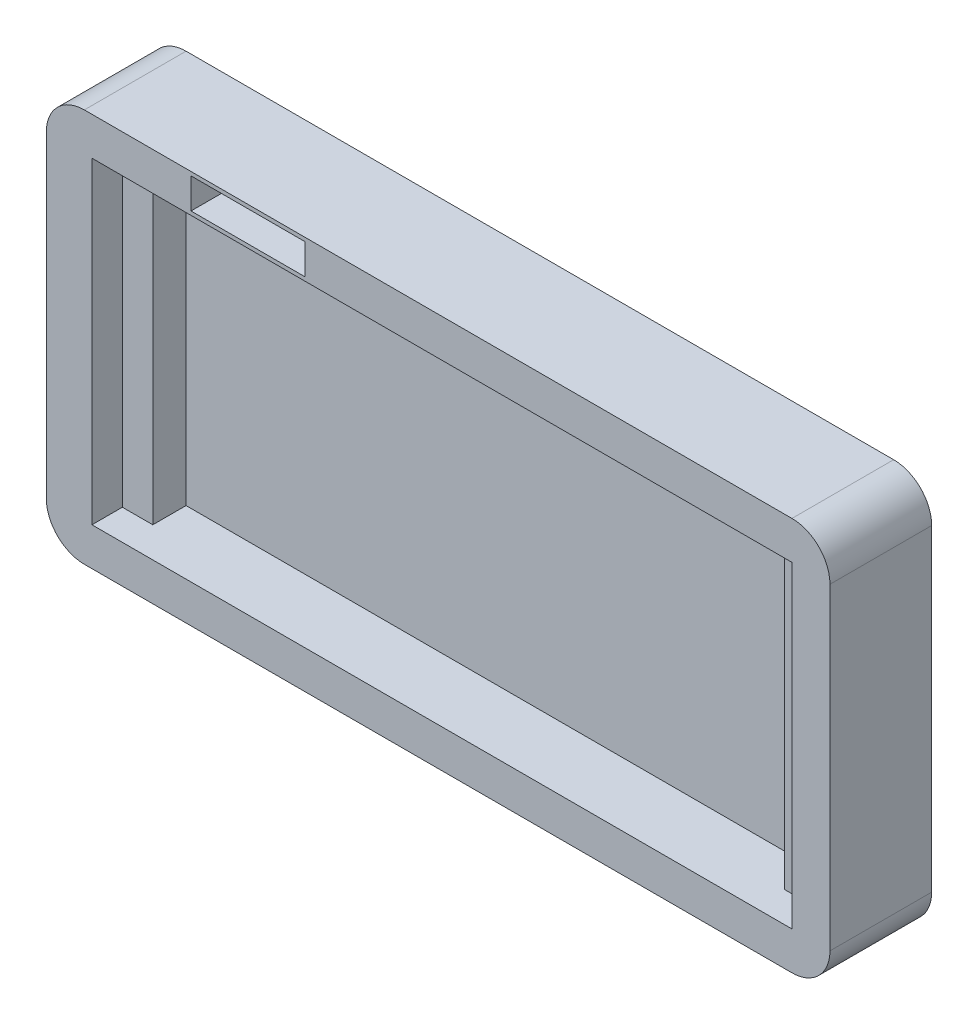
ISO-10303-21;
HEADER;
FILE_DESCRIPTION(('STEP AP214'),'2;1');
FILE_NAME('part.step','',(''),(''),'','','');
FILE_SCHEMA(('AUTOMOTIVE_DESIGN { 1 0 10303 214 1 1 1 1 }'));
ENDSEC;
DATA;
#1=APPLICATION_CONTEXT('core data for automotive mechanical design processes');
#2=APPLICATION_PROTOCOL_DEFINITION('international standard','automotive_design',2000,#1);
#3=PRODUCT_CONTEXT('',#1,'mechanical');
#4=PRODUCT('Part','Part','',(#3));
#5=PRODUCT_RELATED_PRODUCT_CATEGORY('part','',(#4));
#6=PRODUCT_DEFINITION_FORMATION('','',#4);
#7=PRODUCT_DEFINITION_CONTEXT('part definition',#1,'design');
#8=PRODUCT_DEFINITION('design','',#6,#7);
#9=PRODUCT_DEFINITION_SHAPE('','',#8);
#10=(LENGTH_UNIT() NAMED_UNIT(*) SI_UNIT(.MILLI.,.METRE.));
#11=(NAMED_UNIT(*) PLANE_ANGLE_UNIT() SI_UNIT($,.RADIAN.));
#12=(NAMED_UNIT(*) SI_UNIT($,.STERADIAN.) SOLID_ANGLE_UNIT());
#13=UNCERTAINTY_MEASURE_WITH_UNIT(LENGTH_MEASURE(1.E-05),#10,'distance_accuracy_value','');
#14=(GEOMETRIC_REPRESENTATION_CONTEXT(3) GLOBAL_UNCERTAINTY_ASSIGNED_CONTEXT((#13)) GLOBAL_UNIT_ASSIGNED_CONTEXT((#10,
#11,#12)) REPRESENTATION_CONTEXT('',''));
#15=CARTESIAN_POINT('',(0.,0.,0.));
#16=DIRECTION('',(0.,0.,1.));
#17=DIRECTION('',(1.,0.,0.));
#18=AXIS2_PLACEMENT_3D('',#15,#16,#17);
#19=CARTESIAN_POINT('',(-0.0577492853296274,28.6510718351438,44.1448330061541));
#20=DIRECTION('',(0.,-1.,0.));
#21=DIRECTION('',(0.,0.,-1.));
#22=AXIS2_PLACEMENT_3D('',#19,#20,#21);
#23=PLANE('',#22);
#24=DIRECTION('',(1.,0.,0.));
#25=VECTOR('',#24,1.);
#26=CARTESIAN_POINT('',(-0.0577492853296274,28.6510718351438,3.35));
#27=LINE('',#26,#25);
#28=CARTESIAN_POINT('',(0.342250714670373,28.6510718351438,3.35));
#29=VERTEX_POINT('',#28);
#30=CARTESIAN_POINT('',(37.1622507146704,28.6510718351438,3.35000000000001));
#31=VERTEX_POINT('',#30);
#32=EDGE_CURVE('E301',#29,#31,#27,.T.);
#33=ORIENTED_EDGE('',*,*,#32,.F.);
#34=DIRECTION('',(0.,0.,-1.));
#35=VECTOR('',#34,1.);
#36=CARTESIAN_POINT('',(0.342250714670373,28.6510718351438,3.35));
#37=LINE('',#36,#35);
#38=CARTESIAN_POINT('',(0.342250714670373,28.6510718351438,1.75));
#39=VERTEX_POINT('',#38);
#40=EDGE_CURVE('E253',#29,#39,#37,.T.);
#41=ORIENTED_EDGE('',*,*,#40,.T.);
#42=DIRECTION('',(-1.,0.,0.));
#43=VECTOR('',#42,1.);
#44=CARTESIAN_POINT('',(-0.0577492853296274,28.6510718351438,1.75));
#45=LINE('',#44,#43);
#46=CARTESIAN_POINT('',(1.94225071467037,28.6510718351438,1.74999999999999));
#47=VERTEX_POINT('',#46);
#48=EDGE_CURVE('E290',#47,#39,#45,.T.);
#49=ORIENTED_EDGE('',*,*,#48,.F.);
#50=DIRECTION('',(0.,0.,-1.));
#51=VECTOR('',#50,1.);
#52=CARTESIAN_POINT('',(1.94225071467037,28.6510718351438,18.5693341128595));
#53=LINE('',#52,#51);
#54=CARTESIAN_POINT('',(1.94225071467037,28.6510718351438,0.));
#55=VERTEX_POINT('',#54);
#56=EDGE_CURVE('E283',#47,#55,#53,.T.);
#57=ORIENTED_EDGE('',*,*,#56,.T.);
#58=DIRECTION('',(-1.,0.,0.));
#59=VECTOR('',#58,1.);
#60=CARTESIAN_POINT('',(-0.0577492853296274,28.6510718351438,0.));
#61=LINE('',#60,#59);
#62=CARTESIAN_POINT('',(35.1622507146704,28.6510718351438,0.));
#63=VERTEX_POINT('',#62);
#64=EDGE_CURVE('E307',#63,#55,#61,.T.);
#65=ORIENTED_EDGE('',*,*,#64,.F.);
#66=DIRECTION('',(0.,0.,-1.));
#67=VECTOR('',#66,1.);
#68=CARTESIAN_POINT('',(35.1622507146704,28.6510718351438,18.5693341128595));
#69=LINE('',#68,#67);
#70=CARTESIAN_POINT('',(35.1622507146704,28.6510718351438,1.74999999999999));
#71=VERTEX_POINT('',#70);
#72=EDGE_CURVE('E259',#71,#63,#69,.T.);
#73=ORIENTED_EDGE('',*,*,#72,.F.);
#74=DIRECTION('',(-1.,0.,0.));
#75=VECTOR('',#74,1.);
#76=CARTESIAN_POINT('',(37.1622507146704,28.6510718351438,1.75));
#77=LINE('',#76,#75);
#78=CARTESIAN_POINT('',(37.1622507146704,28.6510718351438,1.75));
#79=VERTEX_POINT('',#78);
#80=EDGE_CURVE('E268',#79,#71,#77,.T.);
#81=ORIENTED_EDGE('',*,*,#80,.F.);
#82=DIRECTION('',(0.,0.,-1.));
#83=VECTOR('',#82,1.);
#84=CARTESIAN_POINT('',(37.1622507146704,28.6510718351438,44.1448330061541));
#85=LINE('',#84,#83);
#86=EDGE_CURVE('E309',#31,#79,#85,.T.);
#87=ORIENTED_EDGE('',*,*,#86,.F.);
#88=EDGE_LOOP('',(#33,#41,#49,#57,#65,#73,#81,#87));
#89=FACE_BOUND('',#88,.T.);
#90=ADVANCED_FACE('F33',(#89),#23,.T.);
#91=CARTESIAN_POINT('',(-0.0577492853296253,11.9510718351438,44.1448330061541));
#92=DIRECTION('',(0.,1.,0.));
#93=DIRECTION('',(0.,0.,1.));
#94=AXIS2_PLACEMENT_3D('',#91,#92,#93);
#95=PLANE('',#94);
#96=DIRECTION('',(1.,0.,0.));
#97=VECTOR('',#96,1.);
#98=CARTESIAN_POINT('',(-0.0577492853296253,11.9510718351438,1.75));
#99=LINE('',#98,#97);
#100=CARTESIAN_POINT('',(0.342250714670373,11.9510718351438,1.75));
#101=VERTEX_POINT('',#100);
#102=CARTESIAN_POINT('',(1.94225071467037,11.9510718351438,1.74999999999999));
#103=VERTEX_POINT('',#102);
#104=EDGE_CURVE('E288',#101,#103,#99,.T.);
#105=ORIENTED_EDGE('',*,*,#104,.F.);
#106=DIRECTION('',(0.,0.,-1.));
#107=VECTOR('',#106,1.);
#108=CARTESIAN_POINT('',(0.342250714670374,11.9510718351438,3.35));
#109=LINE('',#108,#107);
#110=CARTESIAN_POINT('',(0.342250714670374,11.9510718351438,3.35));
#111=VERTEX_POINT('',#110);
#112=EDGE_CURVE('E257',#111,#101,#109,.T.);
#113=ORIENTED_EDGE('',*,*,#112,.F.);
#114=DIRECTION('',(-1.,0.,0.));
#115=VECTOR('',#114,1.);
#116=CARTESIAN_POINT('',(-0.0577492853296253,11.9510718351438,3.35));
#117=LINE('',#116,#115);
#118=CARTESIAN_POINT('',(37.1622507146704,11.9510718351438,3.35));
#119=VERTEX_POINT('',#118);
#120=EDGE_CURVE('E300',#119,#111,#117,.T.);
#121=ORIENTED_EDGE('',*,*,#120,.F.);
#122=DIRECTION('',(0.,0.,-1.));
#123=VECTOR('',#122,1.);
#124=CARTESIAN_POINT('',(37.1622507146704,11.9510718351438,44.1448330061541));
#125=LINE('',#124,#123);
#126=CARTESIAN_POINT('',(37.1622507146704,11.9510718351438,1.75000000000001));
#127=VERTEX_POINT('',#126);
#128=EDGE_CURVE('E311',#119,#127,#125,.T.);
#129=ORIENTED_EDGE('',*,*,#128,.T.);
#130=DIRECTION('',(1.,0.,0.));
#131=VECTOR('',#130,1.);
#132=CARTESIAN_POINT('',(37.1622507146704,11.9510718351438,1.75));
#133=LINE('',#132,#131);
#134=CARTESIAN_POINT('',(35.1622507146704,11.9510718351438,1.74999999999999));
#135=VERTEX_POINT('',#134);
#136=EDGE_CURVE('E274',#135,#127,#133,.T.);
#137=ORIENTED_EDGE('',*,*,#136,.F.);
#138=DIRECTION('',(0.,0.,-1.));
#139=VECTOR('',#138,1.);
#140=CARTESIAN_POINT('',(35.1622507146704,11.9510718351438,18.5693341128595));
#141=LINE('',#140,#139);
#142=CARTESIAN_POINT('',(35.1622507146704,11.9510718351438,0.));
#143=VERTEX_POINT('',#142);
#144=EDGE_CURVE('E263',#135,#143,#141,.T.);
#145=ORIENTED_EDGE('',*,*,#144,.T.);
#146=DIRECTION('',(1.,0.,0.));
#147=VECTOR('',#146,1.);
#148=CARTESIAN_POINT('',(-0.0577492853296253,11.9510718351438,0.));
#149=LINE('',#148,#147);
#150=CARTESIAN_POINT('',(1.94225071467037,11.9510718351438,0.));
#151=VERTEX_POINT('',#150);
#152=EDGE_CURVE('E287',#151,#143,#149,.T.);
#153=ORIENTED_EDGE('',*,*,#152,.F.);
#154=DIRECTION('',(0.,0.,-1.));
#155=VECTOR('',#154,1.);
#156=CARTESIAN_POINT('',(1.94225071467037,11.9510718351438,18.5693341128595));
#157=LINE('',#156,#155);
#158=EDGE_CURVE('E267',#103,#151,#157,.T.);
#159=ORIENTED_EDGE('',*,*,#158,.F.);
#160=EDGE_LOOP('',(#105,#113,#121,#129,#137,#145,#153,#159));
#161=FACE_BOUND('',#160,.T.);
#162=ADVANCED_FACE('F411',(#161),#95,.T.);
#163=CARTESIAN_POINT('',(-73.7477492853296,103.321071835144,1.75));
#164=DIRECTION('',(0.,0.,1.));
#165=DIRECTION('',(1.,0.,0.));
#166=AXIS2_PLACEMENT_3D('',#163,#164,#165);
#167=PLANE('',#166);
#168=ORIENTED_EDGE('',*,*,#48,.T.);
#169=DIRECTION('',(0.,1.,0.));
#170=VECTOR('',#169,1.);
#171=CARTESIAN_POINT('',(0.342250714670373,28.6510718351438,1.75));
#172=LINE('',#171,#170);
#173=EDGE_CURVE('E245',#101,#39,#172,.T.);
#174=ORIENTED_EDGE('',*,*,#173,.F.);
#175=ORIENTED_EDGE('',*,*,#104,.T.);
#176=DIRECTION('',(0.,1.,0.));
#177=VECTOR('',#176,1.);
#178=CARTESIAN_POINT('',(1.94225071467037,28.6510718351438,1.75));
#179=LINE('',#178,#177);
#180=EDGE_CURVE('E284',#103,#47,#179,.T.);
#181=ORIENTED_EDGE('',*,*,#180,.T.);
#182=EDGE_LOOP('',(#168,#174,#175,#181));
#183=FACE_BOUND('',#182,.T.);
#184=ADVANCED_FACE('F417',(#183),#167,.T.);
#185=CARTESIAN_POINT('',(0.,0.,0.));
#186=DIRECTION('',(0.,0.,1.));
#187=DIRECTION('',(1.,0.,0.));
#188=AXIS2_PLACEMENT_3D('',#185,#186,#187);
#189=PLANE('',#188);
#190=ORIENTED_EDGE('',*,*,#152,.T.);
#191=DIRECTION('',(0.,-1.,0.));
#192=VECTOR('',#191,1.);
#193=CARTESIAN_POINT('',(35.1622507146704,28.6510718351438,0.));
#194=LINE('',#193,#192);
#195=EDGE_CURVE('E260',#63,#143,#194,.T.);
#196=ORIENTED_EDGE('',*,*,#195,.F.);
#197=ORIENTED_EDGE('',*,*,#64,.T.);
#198=DIRECTION('',(0.,1.,0.));
#199=VECTOR('',#198,1.);
#200=CARTESIAN_POINT('',(1.94225071467037,28.6510718351438,0.));
#201=LINE('',#200,#199);
#202=EDGE_CURVE('E280',#151,#55,#201,.T.);
#203=ORIENTED_EDGE('',*,*,#202,.F.);
#204=EDGE_LOOP('',(#190,#196,#197,#203));
#205=FACE_BOUND('',#204,.T.);
#206=ADVANCED_FACE('F423',(#205),#189,.T.);
#207=CARTESIAN_POINT('',(0.,0.,-2.));
#208=DIRECTION('',(0.,0.,1.));
#209=DIRECTION('',(1.,0.,0.));
#210=AXIS2_PLACEMENT_3D('',#207,#208,#209);
#211=PLANE('',#210);
#212=DIRECTION('',(-1.,0.,0.));
#213=VECTOR('',#212,1.);
#214=CARTESIAN_POINT('',(0.,30.4510718351438,-2.));
#215=LINE('',#214,#213);
#216=CARTESIAN_POINT('',(12.5522507146704,30.4510718351438,-2.));
#217=VERTEX_POINT('',#216);
#218=CARTESIAN_POINT('',(4.55225071467037,30.4510718351438,-2.));
#219=VERTEX_POINT('',#218);
#220=EDGE_CURVE('E41',#217,#219,#215,.T.);
#221=ORIENTED_EDGE('',*,*,#220,.T.);
#222=DIRECTION('',(0.,-1.,0.));
#223=VECTOR('',#222,1.);
#224=CARTESIAN_POINT('',(4.55225071467039,0.,-2.));
#225=LINE('',#224,#223);
#226=CARTESIAN_POINT('',(4.55225071467037,28.8510718351438,-2.));
#227=VERTEX_POINT('',#226);
#228=EDGE_CURVE('E11',#219,#227,#225,.T.);
#229=ORIENTED_EDGE('',*,*,#228,.T.);
#230=DIRECTION('',(1.,0.,0.));
#231=VECTOR('',#230,1.);
#232=CARTESIAN_POINT('',(0.,28.8510718351438,-2.));
#233=LINE('',#232,#231);
#234=CARTESIAN_POINT('',(12.5522507146704,28.8510718351438,-2.));
#235=VERTEX_POINT('',#234);
#236=EDGE_CURVE('E201',#227,#235,#233,.T.);
#237=ORIENTED_EDGE('',*,*,#236,.T.);
#238=DIRECTION('',(0.,1.,0.));
#239=VECTOR('',#238,1.);
#240=CARTESIAN_POINT('',(12.5522507146704,0.,-2.));
#241=LINE('',#240,#239);
#242=EDGE_CURVE('E375',#235,#217,#241,.T.);
#243=ORIENTED_EDGE('',*,*,#242,.T.);
#244=EDGE_LOOP('',(#221,#229,#237,#243));
#245=FACE_BOUND('',#244,.T.);
#246=DIRECTION('',(0.,1.,0.));
#247=VECTOR('',#246,1.);
#248=CARTESIAN_POINT('',(39.1622507146704,28.6510718351438,-2.));
#249=LINE('',#248,#247);
#250=CARTESIAN_POINT('',(39.1622507146704,11.9510718351438,-2.));
#251=VERTEX_POINT('',#250);
#252=CARTESIAN_POINT('',(39.1622507146704,28.6510718351438,-2.));
#253=VERTEX_POINT('',#252);
#254=EDGE_CURVE('E322',#251,#253,#249,.T.);
#255=ORIENTED_EDGE('',*,*,#254,.F.);
#256=CARTESIAN_POINT('',(37.1622507146704,11.9510718351438,-2.));
#257=DIRECTION('',(0.,0.,1.));
#258=DIRECTION('',(1.,0.,0.));
#259=AXIS2_PLACEMENT_3D('',#256,#257,#258);
#260=CIRCLE('',#259,2.);
#261=CARTESIAN_POINT('',(37.1622507146704,9.9510718351438,-2.));
#262=VERTEX_POINT('',#261);
#263=EDGE_CURVE('E349',#251,#262,#260,.F.);
#264=ORIENTED_EDGE('',*,*,#263,.T.);
#265=DIRECTION('',(1.,0.,0.));
#266=VECTOR('',#265,1.);
#267=CARTESIAN_POINT('',(-0.0577492853296253,9.9510718351438,-2.));
#268=LINE('',#267,#266);
#269=CARTESIAN_POINT('',(-0.0577492853296253,9.9510718351438,-2.));
#270=VERTEX_POINT('',#269);
#271=EDGE_CURVE('E317',#270,#262,#268,.T.);
#272=ORIENTED_EDGE('',*,*,#271,.F.);
#273=CARTESIAN_POINT('',(-0.0577492853296253,11.9510718351438,-2.));
#274=DIRECTION('',(0.,0.,1.));
#275=DIRECTION('',(1.,0.,0.));
#276=AXIS2_PLACEMENT_3D('',#273,#274,#275);
#277=CIRCLE('',#276,2.);
#278=CARTESIAN_POINT('',(-2.05774928532962,11.9510718351438,-2.));
#279=VERTEX_POINT('',#278);
#280=EDGE_CURVE('E347',#270,#279,#277,.F.);
#281=ORIENTED_EDGE('',*,*,#280,.T.);
#282=DIRECTION('',(0.,-1.,0.));
#283=VECTOR('',#282,1.);
#284=CARTESIAN_POINT('',(-2.05774928532963,28.6510718351438,-2.));
#285=LINE('',#284,#283);
#286=CARTESIAN_POINT('',(-2.05774928532963,28.6510718351438,-2.));
#287=VERTEX_POINT('',#286);
#288=EDGE_CURVE('E304',#287,#279,#285,.T.);
#289=ORIENTED_EDGE('',*,*,#288,.F.);
#290=CARTESIAN_POINT('',(-0.0577492853296273,28.6510718351438,-2.));
#291=DIRECTION('',(0.,0.,1.));
#292=DIRECTION('',(1.,0.,0.));
#293=AXIS2_PLACEMENT_3D('',#290,#291,#292);
#294=CIRCLE('',#293,2.);
#295=CARTESIAN_POINT('',(-0.0577492853296273,30.6510718351438,-2.));
#296=VERTEX_POINT('',#295);
#297=EDGE_CURVE('E345',#287,#296,#294,.F.);
#298=ORIENTED_EDGE('',*,*,#297,.T.);
#299=DIRECTION('',(-1.,0.,0.));
#300=VECTOR('',#299,1.);
#301=CARTESIAN_POINT('',(-0.0577492853296274,30.6510718351438,-2.));
#302=LINE('',#301,#300);
#303=CARTESIAN_POINT('',(37.1622507146704,30.6510718351438,-2.));
#304=VERTEX_POINT('',#303);
#305=EDGE_CURVE('E318',#304,#296,#302,.T.);
#306=ORIENTED_EDGE('',*,*,#305,.F.);
#307=CARTESIAN_POINT('',(37.1622507146704,28.6510718351438,-2.));
#308=DIRECTION('',(0.,0.,1.));
#309=DIRECTION('',(1.,0.,0.));
#310=AXIS2_PLACEMENT_3D('',#307,#308,#309);
#311=CIRCLE('',#310,2.);
#312=EDGE_CURVE('E343',#304,#253,#311,.F.);
#313=ORIENTED_EDGE('',*,*,#312,.T.);
#314=EDGE_LOOP('',(#255,#264,#272,#281,#289,#298,#306,#313));
#315=FACE_BOUND('',#314,.T.);
#316=ADVANCED_FACE('F379',(#245,#315),#211,.F.);
#317=CARTESIAN_POINT('',(-0.0577492853296274,30.6510718351438,44.1448330061541));
#318=DIRECTION('',(0.,-1.,0.));
#319=DIRECTION('',(0.,0.,-1.));
#320=AXIS2_PLACEMENT_3D('',#317,#318,#319);
#321=PLANE('',#320);
#322=ORIENTED_EDGE('',*,*,#305,.T.);
#323=DIRECTION('',(0.,0.,-1.));
#324=VECTOR('',#323,1.);
#325=CARTESIAN_POINT('',(-0.0577492853296274,30.6510718351438,44.1448330061541));
#326=LINE('',#325,#324);
#327=CARTESIAN_POINT('',(-0.0577492853296273,30.6510718351438,3.35));
#328=VERTEX_POINT('',#327);
#329=EDGE_CURVE('E372',#296,#328,#326,.F.);
#330=ORIENTED_EDGE('',*,*,#329,.T.);
#331=DIRECTION('',(1.,0.,0.));
#332=VECTOR('',#331,1.);
#333=CARTESIAN_POINT('',(-0.0577492853296274,30.6510718351438,3.35));
#334=LINE('',#333,#332);
#335=CARTESIAN_POINT('',(37.1622507146704,30.6510718351438,3.35));
#336=VERTEX_POINT('',#335);
#337=EDGE_CURVE('E321',#328,#336,#334,.T.);
#338=ORIENTED_EDGE('',*,*,#337,.T.);
#339=DIRECTION('',(0.,0.,-1.));
#340=VECTOR('',#339,1.);
#341=CARTESIAN_POINT('',(37.1622507146704,30.6510718351438,44.1448330061541));
#342=LINE('',#341,#340);
#343=EDGE_CURVE('E369',#336,#304,#342,.T.);
#344=ORIENTED_EDGE('',*,*,#343,.T.);
#345=EDGE_LOOP('',(#322,#330,#338,#344));
#346=FACE_BOUND('',#345,.T.);
#347=ADVANCED_FACE('F435',(#346),#321,.F.);
#348=CARTESIAN_POINT('',(39.1622507146704,28.6510718351438,44.1448330061541));
#349=DIRECTION('',(-1.,0.,0.));
#350=DIRECTION('',(0.,0.,1.));
#351=AXIS2_PLACEMENT_3D('',#348,#349,#350);
#352=PLANE('',#351);
#353=DIRECTION('',(0.,-1.,0.));
#354=VECTOR('',#353,1.);
#355=CARTESIAN_POINT('',(39.1622507146704,28.6510718351438,3.35));
#356=LINE('',#355,#354);
#357=CARTESIAN_POINT('',(39.1622507146704,28.6510718351438,3.35));
#358=VERTEX_POINT('',#357);
#359=CARTESIAN_POINT('',(39.1622507146704,11.9510718351438,3.35));
#360=VERTEX_POINT('',#359);
#361=EDGE_CURVE('E329',#358,#360,#356,.T.);
#362=ORIENTED_EDGE('',*,*,#361,.T.);
#363=DIRECTION('',(0.,0.,-1.));
#364=VECTOR('',#363,1.);
#365=CARTESIAN_POINT('',(39.1622507146704,11.9510718351438,44.1448330061541));
#366=LINE('',#365,#364);
#367=EDGE_CURVE('E340',#360,#251,#366,.T.);
#368=ORIENTED_EDGE('',*,*,#367,.T.);
#369=ORIENTED_EDGE('',*,*,#254,.T.);
#370=DIRECTION('',(0.,0.,-1.));
#371=VECTOR('',#370,1.);
#372=CARTESIAN_POINT('',(39.1622507146704,28.6510718351438,44.1448330061541));
#373=LINE('',#372,#371);
#374=EDGE_CURVE('E333',#253,#358,#373,.F.);
#375=ORIENTED_EDGE('',*,*,#374,.T.);
#376=EDGE_LOOP('',(#362,#368,#369,#375));
#377=FACE_BOUND('',#376,.T.);
#378=ADVANCED_FACE('F438',(#377),#352,.F.);
#379=CARTESIAN_POINT('',(-0.0577492853296253,9.9510718351438,44.1448330061541));
#380=DIRECTION('',(0.,1.,0.));
#381=DIRECTION('',(0.,0.,1.));
#382=AXIS2_PLACEMENT_3D('',#379,#380,#381);
#383=PLANE('',#382);
#384=ORIENTED_EDGE('',*,*,#271,.T.);
#385=DIRECTION('',(0.,0.,-1.));
#386=VECTOR('',#385,1.);
#387=CARTESIAN_POINT('',(37.1622507146704,9.9510718351438,44.1448330061541));
#388=LINE('',#387,#386);
#389=CARTESIAN_POINT('',(37.1622507146704,9.9510718351438,3.35));
#390=VERTEX_POINT('',#389);
#391=EDGE_CURVE('E354',#262,#390,#388,.F.);
#392=ORIENTED_EDGE('',*,*,#391,.T.);
#393=DIRECTION('',(-1.,0.,0.));
#394=VECTOR('',#393,1.);
#395=CARTESIAN_POINT('',(-0.0577492853296253,9.9510718351438,3.35));
#396=LINE('',#395,#394);
#397=CARTESIAN_POINT('',(-0.0577492853296253,9.9510718351438,3.35));
#398=VERTEX_POINT('',#397);
#399=EDGE_CURVE('E334',#390,#398,#396,.T.);
#400=ORIENTED_EDGE('',*,*,#399,.T.);
#401=DIRECTION('',(0.,0.,-1.));
#402=VECTOR('',#401,1.);
#403=CARTESIAN_POINT('',(-0.0577492853296253,9.9510718351438,44.1448330061541));
#404=LINE('',#403,#402);
#405=EDGE_CURVE('E351',#398,#270,#404,.T.);
#406=ORIENTED_EDGE('',*,*,#405,.T.);
#407=EDGE_LOOP('',(#384,#392,#400,#406));
#408=FACE_BOUND('',#407,.T.);
#409=ADVANCED_FACE('F442',(#408),#383,.F.);
#410=CARTESIAN_POINT('',(-2.05774928532963,28.6510718351438,44.1448330061541));
#411=DIRECTION('',(1.,0.,0.));
#412=DIRECTION('',(0.,1.,0.));
#413=AXIS2_PLACEMENT_3D('',#410,#411,#412);
#414=PLANE('',#413);
#415=ORIENTED_EDGE('',*,*,#288,.T.);
#416=DIRECTION('',(0.,0.,-1.));
#417=VECTOR('',#416,1.);
#418=CARTESIAN_POINT('',(-2.05774928532962,11.9510718351438,44.1448330061541));
#419=LINE('',#418,#417);
#420=CARTESIAN_POINT('',(-2.05774928532962,11.9510718351438,3.35));
#421=VERTEX_POINT('',#420);
#422=EDGE_CURVE('E367',#279,#421,#419,.F.);
#423=ORIENTED_EDGE('',*,*,#422,.T.);
#424=DIRECTION('',(0.,1.,0.));
#425=VECTOR('',#424,1.);
#426=CARTESIAN_POINT('',(-2.05774928532963,28.6510718351438,3.35));
#427=LINE('',#426,#425);
#428=CARTESIAN_POINT('',(-2.05774928532963,28.6510718351438,3.35));
#429=VERTEX_POINT('',#428);
#430=EDGE_CURVE('E330',#421,#429,#427,.T.);
#431=ORIENTED_EDGE('',*,*,#430,.T.);
#432=DIRECTION('',(0.,0.,-1.));
#433=VECTOR('',#432,1.);
#434=CARTESIAN_POINT('',(-2.05774928532963,28.6510718351438,44.1448330061541));
#435=LINE('',#434,#433);
#436=EDGE_CURVE('E364',#429,#287,#435,.T.);
#437=ORIENTED_EDGE('',*,*,#436,.T.);
#438=EDGE_LOOP('',(#415,#423,#431,#437));
#439=FACE_BOUND('',#438,.T.);
#440=ADVANCED_FACE('F432',(#439),#414,.F.);
#441=CARTESIAN_POINT('',(18.7522507146704,20.3010718351438,3.35));
#442=DIRECTION('',(0.,0.,-1.));
#443=DIRECTION('',(0.,-1.,0.));
#444=AXIS2_PLACEMENT_3D('',#441,#442,#443);
#445=PLANE('',#444);
#446=DIRECTION('',(-1.,0.,0.));
#447=VECTOR('',#446,1.);
#448=CARTESIAN_POINT('',(5.55225071467037,30.4510718351438,3.35));
#449=LINE('',#448,#447);
#450=CARTESIAN_POINT('',(11.5522507146704,30.4510718351438,3.35));
#451=VERTEX_POINT('',#450);
#452=CARTESIAN_POINT('',(5.55225071467037,30.4510718351438,3.35));
#453=VERTEX_POINT('',#452);
#454=EDGE_CURVE('E236',#451,#453,#449,.T.);
#455=ORIENTED_EDGE('',*,*,#454,.F.);
#456=DIRECTION('',(0.,1.,0.));
#457=VECTOR('',#456,1.);
#458=CARTESIAN_POINT('',(11.5522507146704,30.4510718351438,3.35));
#459=LINE('',#458,#457);
#460=CARTESIAN_POINT('',(11.5522507146704,28.8510718351438,3.35));
#461=VERTEX_POINT('',#460);
#462=EDGE_CURVE('E56',#461,#451,#459,.T.);
#463=ORIENTED_EDGE('',*,*,#462,.F.);
#464=DIRECTION('',(1.,0.,0.));
#465=VECTOR('',#464,1.);
#466=CARTESIAN_POINT('',(5.55225071467037,28.8510718351438,3.35));
#467=LINE('',#466,#465);
#468=CARTESIAN_POINT('',(5.55225071467037,28.8510718351438,3.35));
#469=VERTEX_POINT('',#468);
#470=EDGE_CURVE('E232',#469,#461,#467,.T.);
#471=ORIENTED_EDGE('',*,*,#470,.F.);
#472=DIRECTION('',(0.,-1.,0.));
#473=VECTOR('',#472,1.);
#474=CARTESIAN_POINT('',(5.55225071467037,30.4510718351438,3.35));
#475=LINE('',#474,#473);
#476=EDGE_CURVE('E239',#453,#469,#475,.T.);
#477=ORIENTED_EDGE('',*,*,#476,.F.);
#478=EDGE_LOOP('',(#455,#463,#471,#477));
#479=FACE_BOUND('',#478,.T.);
#480=ORIENTED_EDGE('',*,*,#120,.T.);
#481=DIRECTION('',(0.,1.,0.));
#482=VECTOR('',#481,1.);
#483=CARTESIAN_POINT('',(0.342250714670373,28.6510718351438,3.35));
#484=LINE('',#483,#482);
#485=EDGE_CURVE('E251',#111,#29,#484,.T.);
#486=ORIENTED_EDGE('',*,*,#485,.T.);
#487=ORIENTED_EDGE('',*,*,#32,.T.);
#488=DIRECTION('',(0.,-1.,0.));
#489=VECTOR('',#488,1.);
#490=CARTESIAN_POINT('',(37.1622507146704,28.6510718351438,3.35));
#491=LINE('',#490,#489);
#492=EDGE_CURVE('E297',#31,#119,#491,.T.);
#493=ORIENTED_EDGE('',*,*,#492,.T.);
#494=EDGE_LOOP('',(#480,#486,#487,#493));
#495=FACE_BOUND('',#494,.T.);
#496=ORIENTED_EDGE('',*,*,#399,.F.);
#497=CARTESIAN_POINT('',(37.1622507146704,11.9510718351438,3.35));
#498=DIRECTION('',(0.,0.,-1.));
#499=DIRECTION('',(-1.,0.,0.));
#500=AXIS2_PLACEMENT_3D('',#497,#498,#499);
#501=CIRCLE('',#500,2.);
#502=EDGE_CURVE('E362',#390,#360,#501,.F.);
#503=ORIENTED_EDGE('',*,*,#502,.T.);
#504=ORIENTED_EDGE('',*,*,#361,.F.);
#505=CARTESIAN_POINT('',(37.1622507146704,28.6510718351438,3.35));
#506=DIRECTION('',(0.,0.,-1.));
#507=DIRECTION('',(-1.,0.,0.));
#508=AXIS2_PLACEMENT_3D('',#505,#506,#507);
#509=CIRCLE('',#508,2.);
#510=EDGE_CURVE('E356',#358,#336,#509,.F.);
#511=ORIENTED_EDGE('',*,*,#510,.T.);
#512=ORIENTED_EDGE('',*,*,#337,.F.);
#513=CARTESIAN_POINT('',(-0.0577492853296273,28.6510718351438,3.35));
#514=DIRECTION('',(0.,0.,-1.));
#515=DIRECTION('',(-1.,0.,0.));
#516=AXIS2_PLACEMENT_3D('',#513,#514,#515);
#517=CIRCLE('',#516,2.);
#518=EDGE_CURVE('E358',#328,#429,#517,.F.);
#519=ORIENTED_EDGE('',*,*,#518,.T.);
#520=ORIENTED_EDGE('',*,*,#430,.F.);
#521=CARTESIAN_POINT('',(-0.0577492853296253,11.9510718351438,3.35));
#522=DIRECTION('',(0.,0.,-1.));
#523=DIRECTION('',(-1.,0.,0.));
#524=AXIS2_PLACEMENT_3D('',#521,#522,#523);
#525=CIRCLE('',#524,2.);
#526=EDGE_CURVE('E360',#421,#398,#525,.F.);
#527=ORIENTED_EDGE('',*,*,#526,.T.);
#528=EDGE_LOOP('',(#496,#503,#504,#511,#512,#519,#520,#527));
#529=FACE_BOUND('',#528,.T.);
#530=ADVANCED_FACE('F397',(#479,#495,#529),#445,.F.);
#531=CARTESIAN_POINT('',(37.1622507146704,28.6510718351438,44.1448330061541));
#532=DIRECTION('',(-1.,0.,0.));
#533=DIRECTION('',(0.,0.,1.));
#534=AXIS2_PLACEMENT_3D('',#531,#532,#533);
#535=PLANE('',#534);
#536=DIRECTION('',(0.,1.,0.));
#537=VECTOR('',#536,1.);
#538=CARTESIAN_POINT('',(37.1622507146704,28.6510718351438,1.75));
#539=LINE('',#538,#537);
#540=EDGE_CURVE('E271',#127,#79,#539,.T.);
#541=ORIENTED_EDGE('',*,*,#540,.F.);
#542=ORIENTED_EDGE('',*,*,#128,.F.);
#543=ORIENTED_EDGE('',*,*,#492,.F.);
#544=ORIENTED_EDGE('',*,*,#86,.T.);
#545=EDGE_LOOP('',(#541,#542,#543,#544));
#546=FACE_BOUND('',#545,.T.);
#547=ADVANCED_FACE('F425',(#546),#535,.T.);
#548=CARTESIAN_POINT('',(37.1622507146704,11.9510718351438,44.1448330061541));
#549=DIRECTION('',(0.,0.,-1.));
#550=DIRECTION('',(-1.,0.,0.));
#551=AXIS2_PLACEMENT_3D('',#548,#549,#550);
#552=CYLINDRICAL_SURFACE('',#551,2.);
#553=ORIENTED_EDGE('',*,*,#502,.F.);
#554=ORIENTED_EDGE('',*,*,#391,.F.);
#555=ORIENTED_EDGE('',*,*,#263,.F.);
#556=ORIENTED_EDGE('',*,*,#367,.F.);
#557=EDGE_LOOP('',(#553,#554,#555,#556));
#558=FACE_BOUND('',#557,.T.);
#559=ADVANCED_FACE('F427',(#558),#552,.T.);
#560=CARTESIAN_POINT('',(-0.0577492853296253,11.9510718351438,44.1448330061541));
#561=DIRECTION('',(0.,0.,-1.));
#562=DIRECTION('',(-1.,0.,0.));
#563=AXIS2_PLACEMENT_3D('',#560,#561,#562);
#564=CYLINDRICAL_SURFACE('',#563,2.);
#565=ORIENTED_EDGE('',*,*,#526,.F.);
#566=ORIENTED_EDGE('',*,*,#422,.F.);
#567=ORIENTED_EDGE('',*,*,#280,.F.);
#568=ORIENTED_EDGE('',*,*,#405,.F.);
#569=EDGE_LOOP('',(#565,#566,#567,#568));
#570=FACE_BOUND('',#569,.T.);
#571=ADVANCED_FACE('F452',(#570),#564,.T.);
#572=CARTESIAN_POINT('',(-0.0577492853296273,28.6510718351438,44.1448330061541));
#573=DIRECTION('',(0.,0.,-1.));
#574=DIRECTION('',(-1.,0.,0.));
#575=AXIS2_PLACEMENT_3D('',#572,#573,#574);
#576=CYLINDRICAL_SURFACE('',#575,2.);
#577=ORIENTED_EDGE('',*,*,#518,.F.);
#578=ORIENTED_EDGE('',*,*,#329,.F.);
#579=ORIENTED_EDGE('',*,*,#297,.F.);
#580=ORIENTED_EDGE('',*,*,#436,.F.);
#581=EDGE_LOOP('',(#577,#578,#579,#580));
#582=FACE_BOUND('',#581,.T.);
#583=ADVANCED_FACE('F455',(#582),#576,.T.);
#584=CARTESIAN_POINT('',(37.1622507146704,28.6510718351438,44.1448330061541));
#585=DIRECTION('',(0.,0.,-1.));
#586=DIRECTION('',(-1.,0.,0.));
#587=AXIS2_PLACEMENT_3D('',#584,#585,#586);
#588=CYLINDRICAL_SURFACE('',#587,2.);
#589=ORIENTED_EDGE('',*,*,#510,.F.);
#590=ORIENTED_EDGE('',*,*,#374,.F.);
#591=ORIENTED_EDGE('',*,*,#312,.F.);
#592=ORIENTED_EDGE('',*,*,#343,.F.);
#593=EDGE_LOOP('',(#589,#590,#591,#592));
#594=FACE_BOUND('',#593,.T.);
#595=ADVANCED_FACE('F35',(#594),#588,.T.);
#596=CARTESIAN_POINT('',(1.94225071467037,28.6510718351438,18.5693341128595));
#597=DIRECTION('',(-1.,0.,0.));
#598=DIRECTION('',(0.,-1.,0.));
#599=AXIS2_PLACEMENT_3D('',#596,#597,#598);
#600=PLANE('',#599);
#601=ORIENTED_EDGE('',*,*,#180,.F.);
#602=ORIENTED_EDGE('',*,*,#158,.T.);
#603=ORIENTED_EDGE('',*,*,#202,.T.);
#604=ORIENTED_EDGE('',*,*,#56,.F.);
#605=EDGE_LOOP('',(#601,#602,#603,#604));
#606=FACE_BOUND('',#605,.T.);
#607=ADVANCED_FACE('F462',(#606),#600,.F.);
#608=CARTESIAN_POINT('',(35.1622507146704,28.6510718351438,18.5693341128595));
#609=DIRECTION('',(1.,0.,0.));
#610=DIRECTION('',(0.,0.,-1.));
#611=AXIS2_PLACEMENT_3D('',#608,#609,#610);
#612=PLANE('',#611);
#613=DIRECTION('',(0.,-1.,0.));
#614=VECTOR('',#613,1.);
#615=CARTESIAN_POINT('',(35.1622507146704,28.6510718351438,1.75));
#616=LINE('',#615,#614);
#617=EDGE_CURVE('E264',#71,#135,#616,.T.);
#618=ORIENTED_EDGE('',*,*,#617,.F.);
#619=ORIENTED_EDGE('',*,*,#72,.T.);
#620=ORIENTED_EDGE('',*,*,#195,.T.);
#621=ORIENTED_EDGE('',*,*,#144,.F.);
#622=EDGE_LOOP('',(#618,#619,#620,#621));
#623=FACE_BOUND('',#622,.T.);
#624=ADVANCED_FACE('F488',(#623),#612,.F.);
#625=CARTESIAN_POINT('',(-73.7477492853296,103.321071835144,1.75));
#626=DIRECTION('',(0.,0.,1.));
#627=DIRECTION('',(1.,0.,0.));
#628=AXIS2_PLACEMENT_3D('',#625,#626,#627);
#629=PLANE('',#628);
#630=ORIENTED_EDGE('',*,*,#136,.T.);
#631=ORIENTED_EDGE('',*,*,#540,.T.);
#632=ORIENTED_EDGE('',*,*,#80,.T.);
#633=ORIENTED_EDGE('',*,*,#617,.T.);
#634=EDGE_LOOP('',(#630,#631,#632,#633));
#635=FACE_BOUND('',#634,.T.);
#636=ADVANCED_FACE('F494',(#635),#629,.T.);
#637=CARTESIAN_POINT('',(0.342250714670373,28.6510718351438,3.35));
#638=DIRECTION('',(-1.,0.,0.));
#639=DIRECTION('',(0.,-1.,0.));
#640=AXIS2_PLACEMENT_3D('',#637,#638,#639);
#641=PLANE('',#640);
#642=ORIENTED_EDGE('',*,*,#173,.T.);
#643=ORIENTED_EDGE('',*,*,#40,.F.);
#644=ORIENTED_EDGE('',*,*,#485,.F.);
#645=ORIENTED_EDGE('',*,*,#112,.T.);
#646=EDGE_LOOP('',(#642,#643,#644,#645));
#647=FACE_BOUND('',#646,.T.);
#648=ADVANCED_FACE('F521',(#647),#641,.F.);
#649=CARTESIAN_POINT('',(11.5522507146704,30.4510718351438,0.349999999999998));
#650=DIRECTION('',(1.,0.,0.));
#651=DIRECTION('',(0.,0.,-1.));
#652=AXIS2_PLACEMENT_3D('',#649,#650,#651);
#653=PLANE('',#652);
#654=ORIENTED_EDGE('',*,*,#462,.T.);
#655=DIRECTION('',(0.,0.,1.));
#656=VECTOR('',#655,1.);
#657=CARTESIAN_POINT('',(11.5522507146704,30.4510718351438,0.349999999999998));
#658=LINE('',#657,#656);
#659=CARTESIAN_POINT('',(11.5522507146704,30.4510718351438,0.349999999999998));
#660=VERTEX_POINT('',#659);
#661=EDGE_CURVE('E234',#660,#451,#658,.T.);
#662=ORIENTED_EDGE('',*,*,#661,.F.);
#663=DIRECTION('',(0.,1.,0.));
#664=VECTOR('',#663,1.);
#665=CARTESIAN_POINT('',(11.5522507146704,30.4510718351438,0.349999999999998));
#666=LINE('',#665,#664);
#667=CARTESIAN_POINT('',(11.5522507146704,28.8510718351438,0.349999999999998));
#668=VERTEX_POINT('',#667);
#669=EDGE_CURVE('E230',#668,#660,#666,.T.);
#670=ORIENTED_EDGE('',*,*,#669,.F.);
#671=DIRECTION('',(0.,0.,1.));
#672=VECTOR('',#671,1.);
#673=CARTESIAN_POINT('',(11.5522507146704,28.8510718351438,0.349999999999998));
#674=LINE('',#673,#672);
#675=EDGE_CURVE('E243',#668,#461,#674,.T.);
#676=ORIENTED_EDGE('',*,*,#675,.T.);
#677=EDGE_LOOP('',(#654,#662,#670,#676));
#678=FACE_BOUND('',#677,.T.);
#679=ADVANCED_FACE('F392',(#678),#653,.F.);
#680=CARTESIAN_POINT('',(5.55225071467037,28.8510718351438,0.349999999999998));
#681=DIRECTION('',(0.,-1.,0.));
#682=DIRECTION('',(0.,0.,-1.));
#683=AXIS2_PLACEMENT_3D('',#680,#681,#682);
#684=PLANE('',#683);
#685=ORIENTED_EDGE('',*,*,#470,.T.);
#686=ORIENTED_EDGE('',*,*,#675,.F.);
#687=DIRECTION('',(1.,0.,0.));
#688=VECTOR('',#687,1.);
#689=CARTESIAN_POINT('',(12.5522507146704,28.8510718351438,0.349999999999998));
#690=LINE('',#689,#688);
#691=CARTESIAN_POINT('',(12.5522507146704,28.8510718351438,0.349999999999998));
#692=VERTEX_POINT('',#691);
#693=EDGE_CURVE('E213',#668,#692,#690,.T.);
#694=ORIENTED_EDGE('',*,*,#693,.T.);
#695=DIRECTION('',(0.,0.,1.));
#696=VECTOR('',#695,1.);
#697=CARTESIAN_POINT('',(12.5522507146704,28.8510718351438,-2.65));
#698=LINE('',#697,#696);
#699=EDGE_CURVE('E48',#235,#692,#698,.T.);
#700=ORIENTED_EDGE('',*,*,#699,.F.);
#701=ORIENTED_EDGE('',*,*,#236,.F.);
#702=DIRECTION('',(0.,0.,1.));
#703=VECTOR('',#702,1.);
#704=CARTESIAN_POINT('',(4.55225071467037,28.8510718351438,-2.65));
#705=LINE('',#704,#703);
#706=CARTESIAN_POINT('',(4.55225071467037,28.8510718351438,0.349999999999998));
#707=VERTEX_POINT('',#706);
#708=EDGE_CURVE('E194',#227,#707,#705,.T.);
#709=ORIENTED_EDGE('',*,*,#708,.T.);
#710=CARTESIAN_POINT('',(5.55225071467037,28.8510718351438,0.349999999999998));
#711=VERTEX_POINT('',#710);
#712=EDGE_CURVE('E198',#707,#711,#690,.T.);
#713=ORIENTED_EDGE('',*,*,#712,.T.);
#714=DIRECTION('',(0.,0.,1.));
#715=VECTOR('',#714,1.);
#716=CARTESIAN_POINT('',(5.55225071467037,28.8510718351438,0.349999999999998));
#717=LINE('',#716,#715);
#718=EDGE_CURVE('E246',#711,#469,#717,.T.);
#719=ORIENTED_EDGE('',*,*,#718,.T.);
#720=EDGE_LOOP('',(#685,#686,#694,#700,#701,#709,#713,#719));
#721=FACE_BOUND('',#720,.T.);
#722=ADVANCED_FACE('F197',(#721),#684,.F.);
#723=CARTESIAN_POINT('',(5.55225071467037,30.4510718351438,0.349999999999998));
#724=DIRECTION('',(-1.,0.,0.));
#725=DIRECTION('',(0.,0.,1.));
#726=AXIS2_PLACEMENT_3D('',#723,#724,#725);
#727=PLANE('',#726);
#728=ORIENTED_EDGE('',*,*,#476,.T.);
#729=ORIENTED_EDGE('',*,*,#718,.F.);
#730=DIRECTION('',(0.,-1.,0.));
#731=VECTOR('',#730,1.);
#732=CARTESIAN_POINT('',(5.55225071467037,30.4510718351438,0.349999999999998));
#733=LINE('',#732,#731);
#734=CARTESIAN_POINT('',(5.55225071467037,30.4510718351438,0.349999999999998));
#735=VERTEX_POINT('',#734);
#736=EDGE_CURVE('E211',#735,#711,#733,.T.);
#737=ORIENTED_EDGE('',*,*,#736,.F.);
#738=DIRECTION('',(0.,0.,1.));
#739=VECTOR('',#738,1.);
#740=CARTESIAN_POINT('',(5.55225071467037,30.4510718351438,0.349999999999998));
#741=LINE('',#740,#739);
#742=EDGE_CURVE('E248',#735,#453,#741,.T.);
#743=ORIENTED_EDGE('',*,*,#742,.T.);
#744=EDGE_LOOP('',(#728,#729,#737,#743));
#745=FACE_BOUND('',#744,.T.);
#746=ADVANCED_FACE('F401',(#745),#727,.F.);
#747=CARTESIAN_POINT('',(5.55225071467037,30.4510718351438,0.349999999999998));
#748=DIRECTION('',(0.,1.,0.));
#749=DIRECTION('',(0.,0.,1.));
#750=AXIS2_PLACEMENT_3D('',#747,#748,#749);
#751=PLANE('',#750);
#752=ORIENTED_EDGE('',*,*,#454,.T.);
#753=ORIENTED_EDGE('',*,*,#742,.F.);
#754=DIRECTION('',(-1.,0.,0.));
#755=VECTOR('',#754,1.);
#756=CARTESIAN_POINT('',(12.5522507146704,30.4510718351438,0.349999999999998));
#757=LINE('',#756,#755);
#758=CARTESIAN_POINT('',(4.55225071467037,30.4510718351438,0.349999999999998));
#759=VERTEX_POINT('',#758);
#760=EDGE_CURVE('E223',#735,#759,#757,.T.);
#761=ORIENTED_EDGE('',*,*,#760,.T.);
#762=DIRECTION('',(0.,0.,1.));
#763=VECTOR('',#762,1.);
#764=CARTESIAN_POINT('',(4.55225071467037,30.4510718351438,-2.65));
#765=LINE('',#764,#763);
#766=EDGE_CURVE('E217',#219,#759,#765,.T.);
#767=ORIENTED_EDGE('',*,*,#766,.F.);
#768=ORIENTED_EDGE('',*,*,#220,.F.);
#769=DIRECTION('',(0.,0.,1.));
#770=VECTOR('',#769,1.);
#771=CARTESIAN_POINT('',(12.5522507146704,30.4510718351438,-2.65));
#772=LINE('',#771,#770);
#773=CARTESIAN_POINT('',(12.5522507146704,30.4510718351438,0.349999999999998));
#774=VERTEX_POINT('',#773);
#775=EDGE_CURVE('E227',#217,#774,#772,.T.);
#776=ORIENTED_EDGE('',*,*,#775,.T.);
#777=EDGE_CURVE('E204',#774,#660,#757,.T.);
#778=ORIENTED_EDGE('',*,*,#777,.T.);
#779=ORIENTED_EDGE('',*,*,#661,.T.);
#780=EDGE_LOOP('',(#752,#753,#761,#767,#768,#776,#778,#779));
#781=FACE_BOUND('',#780,.T.);
#782=ADVANCED_FACE('F383',(#781),#751,.F.);
#783=CARTESIAN_POINT('',(0.,0.,0.349999999999998));
#784=DIRECTION('',(0.,0.,1.));
#785=DIRECTION('',(1.,0.,0.));
#786=AXIS2_PLACEMENT_3D('',#783,#784,#785);
#787=PLANE('',#786);
#788=ORIENTED_EDGE('',*,*,#669,.T.);
#789=ORIENTED_EDGE('',*,*,#777,.F.);
#790=DIRECTION('',(0.,1.,0.));
#791=VECTOR('',#790,1.);
#792=CARTESIAN_POINT('',(12.5522507146704,28.8510718351438,0.349999999999998));
#793=LINE('',#792,#791);
#794=EDGE_CURVE('E212',#692,#774,#793,.T.);
#795=ORIENTED_EDGE('',*,*,#794,.F.);
#796=ORIENTED_EDGE('',*,*,#693,.F.);
#797=EDGE_LOOP('',(#788,#789,#795,#796));
#798=FACE_BOUND('',#797,.T.);
#799=ADVANCED_FACE('F389',(#798),#787,.F.);
#800=CARTESIAN_POINT('',(4.55225071467037,28.8510718351438,-2.65));
#801=DIRECTION('',(-1.,0.,0.));
#802=DIRECTION('',(0.,-1.,0.));
#803=AXIS2_PLACEMENT_3D('',#800,#801,#802);
#804=PLANE('',#803);
#805=ORIENTED_EDGE('',*,*,#766,.T.);
#806=DIRECTION('',(0.,-1.,0.));
#807=VECTOR('',#806,1.);
#808=CARTESIAN_POINT('',(4.55225071467037,28.8510718351438,0.349999999999998));
#809=LINE('',#808,#807);
#810=EDGE_CURVE('E209',#759,#707,#809,.T.);
#811=ORIENTED_EDGE('',*,*,#810,.T.);
#812=ORIENTED_EDGE('',*,*,#708,.F.);
#813=ORIENTED_EDGE('',*,*,#228,.F.);
#814=EDGE_LOOP('',(#805,#811,#812,#813));
#815=FACE_BOUND('',#814,.T.);
#816=ADVANCED_FACE('F215',(#815),#804,.F.);
#817=CARTESIAN_POINT('',(12.5522507146704,28.8510718351438,-2.65));
#818=DIRECTION('',(1.,0.,0.));
#819=DIRECTION('',(0.,0.,-1.));
#820=AXIS2_PLACEMENT_3D('',#817,#818,#819);
#821=PLANE('',#820);
#822=ORIENTED_EDGE('',*,*,#699,.T.);
#823=ORIENTED_EDGE('',*,*,#794,.T.);
#824=ORIENTED_EDGE('',*,*,#775,.F.);
#825=ORIENTED_EDGE('',*,*,#242,.F.);
#826=EDGE_LOOP('',(#822,#823,#824,#825));
#827=FACE_BOUND('',#826,.T.);
#828=ADVANCED_FACE('F385',(#827),#821,.F.);
#829=ORIENTED_EDGE('',*,*,#736,.T.);
#830=ORIENTED_EDGE('',*,*,#712,.F.);
#831=ORIENTED_EDGE('',*,*,#810,.F.);
#832=ORIENTED_EDGE('',*,*,#760,.F.);
#833=EDGE_LOOP('',(#829,#830,#831,#832));
#834=FACE_BOUND('',#833,.T.);
#835=ADVANCED_FACE('F208',(#834),#787,.F.);
#836=CLOSED_SHELL('',(#90,#162,#184,#206,#316,#347,#378,#409,#440,#530,#547,#559,#571,#583,#595,
#607,#624,#636,#648,#679,#722,#746,#782,#799,#816,#828,#835));
#837=MANIFOLD_SOLID_BREP('B2',#836);
#838=ADVANCED_BREP_SHAPE_REPRESENTATION('',(#18,#837),#14);
#839=SHAPE_DEFINITION_REPRESENTATION(#9,#838);
ENDSEC;
END-ISO-10303-21;
